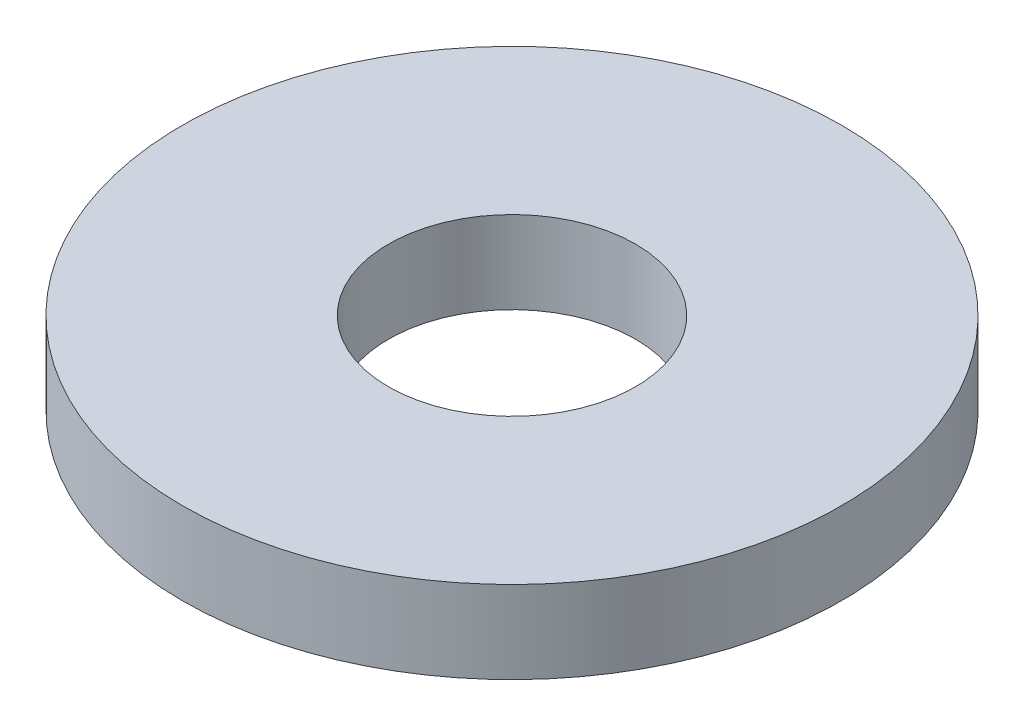
ISO-10303-21;
HEADER;
FILE_DESCRIPTION(('STEP AP214'),'2;1');
FILE_NAME('part.step','',(''),(''),'','','');
FILE_SCHEMA(('AUTOMOTIVE_DESIGN { 1 0 10303 214 1 1 1 1 }'));
ENDSEC;
DATA;
#1=APPLICATION_CONTEXT('core data for automotive mechanical design processes');
#2=APPLICATION_PROTOCOL_DEFINITION('international standard','automotive_design',2000,#1);
#3=PRODUCT_CONTEXT('',#1,'mechanical');
#4=PRODUCT('Part','Part','',(#3));
#5=PRODUCT_RELATED_PRODUCT_CATEGORY('part','',(#4));
#6=PRODUCT_DEFINITION_FORMATION('','',#4);
#7=PRODUCT_DEFINITION_CONTEXT('part definition',#1,'design');
#8=PRODUCT_DEFINITION('design','',#6,#7);
#9=PRODUCT_DEFINITION_SHAPE('','',#8);
#10=(LENGTH_UNIT() NAMED_UNIT(*) SI_UNIT(.MILLI.,.METRE.));
#11=(NAMED_UNIT(*) PLANE_ANGLE_UNIT() SI_UNIT($,.RADIAN.));
#12=(NAMED_UNIT(*) SI_UNIT($,.STERADIAN.) SOLID_ANGLE_UNIT());
#13=UNCERTAINTY_MEASURE_WITH_UNIT(LENGTH_MEASURE(1.E-05),#10,'distance_accuracy_value','');
#14=(GEOMETRIC_REPRESENTATION_CONTEXT(3) GLOBAL_UNCERTAINTY_ASSIGNED_CONTEXT((#13)) GLOBAL_UNIT_ASSIGNED_CONTEXT((#10,
#11,#12)) REPRESENTATION_CONTEXT('',''));
#15=CARTESIAN_POINT('',(0.,0.,0.));
#16=DIRECTION('',(0.,0.,1.));
#17=DIRECTION('',(1.,0.,0.));
#18=AXIS2_PLACEMENT_3D('',#15,#16,#17);
#19=CARTESIAN_POINT('',(0.,1.,0.));
#20=DIRECTION('',(0.,1.,0.));
#21=DIRECTION('',(0.,0.,1.));
#22=AXIS2_PLACEMENT_3D('',#19,#20,#21);
#23=PLANE('',#22);
#24=CARTESIAN_POINT('',(0.,1.,0.));
#25=DIRECTION('',(0.,1.,0.));
#26=DIRECTION('',(0.,0.,1.));
#27=AXIS2_PLACEMENT_3D('',#24,#25,#26);
#28=CIRCLE('',#27,4.);
#29=CARTESIAN_POINT('',(0.,1.,4.));
#30=VERTEX_POINT('',#29);
#31=EDGE_CURVE('E10',#30,#30,#28,.T.);
#32=ORIENTED_EDGE('',*,*,#31,.T.);
#33=EDGE_LOOP('',(#32));
#34=FACE_BOUND('',#33,.T.);
#35=CARTESIAN_POINT('',(0.,1.,0.));
#36=DIRECTION('',(0.,1.,0.));
#37=DIRECTION('',(0.,0.,1.));
#38=AXIS2_PLACEMENT_3D('',#35,#36,#37);
#39=CIRCLE('',#38,1.5);
#40=CARTESIAN_POINT('',(0.,1.,1.5));
#41=VERTEX_POINT('',#40);
#42=EDGE_CURVE('E44',#41,#41,#39,.T.);
#43=ORIENTED_EDGE('',*,*,#42,.F.);
#44=EDGE_LOOP('',(#43));
#45=FACE_BOUND('',#44,.T.);
#46=ADVANCED_FACE('F33',(#34,#45),#23,.T.);
#47=CARTESIAN_POINT('',(0.,0.,0.));
#48=DIRECTION('',(0.,1.,0.));
#49=DIRECTION('',(0.,0.,1.));
#50=AXIS2_PLACEMENT_3D('',#47,#48,#49);
#51=PLANE('',#50);
#52=CARTESIAN_POINT('',(0.,0.,0.));
#53=DIRECTION('',(0.,1.,0.));
#54=DIRECTION('',(0.,0.,1.));
#55=AXIS2_PLACEMENT_3D('',#52,#53,#54);
#56=CIRCLE('',#55,4.);
#57=CARTESIAN_POINT('',(0.,0.,4.));
#58=VERTEX_POINT('',#57);
#59=EDGE_CURVE('E37',#58,#58,#56,.T.);
#60=ORIENTED_EDGE('',*,*,#59,.F.);
#61=EDGE_LOOP('',(#60));
#62=FACE_BOUND('',#61,.T.);
#63=CARTESIAN_POINT('',(0.,0.,0.));
#64=DIRECTION('',(0.,1.,0.));
#65=DIRECTION('',(0.,0.,1.));
#66=AXIS2_PLACEMENT_3D('',#63,#64,#65);
#67=CIRCLE('',#66,1.5);
#68=CARTESIAN_POINT('',(0.,0.,1.5));
#69=VERTEX_POINT('',#68);
#70=EDGE_CURVE('E46',#69,#69,#67,.T.);
#71=ORIENTED_EDGE('',*,*,#70,.T.);
#72=EDGE_LOOP('',(#71));
#73=FACE_BOUND('',#72,.T.);
#74=ADVANCED_FACE('F56',(#62,#73),#51,.F.);
#75=CARTESIAN_POINT('',(0.,1.,0.));
#76=DIRECTION('',(0.,-1.,0.));
#77=DIRECTION('',(0.,0.,-1.));
#78=AXIS2_PLACEMENT_3D('',#75,#76,#77);
#79=CYLINDRICAL_SURFACE('',#78,4.);
#80=ORIENTED_EDGE('',*,*,#31,.F.);
#81=EDGE_LOOP('',(#80));
#82=FACE_BOUND('',#81,.T.);
#83=ORIENTED_EDGE('',*,*,#59,.T.);
#84=EDGE_LOOP('',(#83));
#85=FACE_BOUND('',#84,.T.);
#86=ADVANCED_FACE('F35',(#82,#85),#79,.T.);
#87=CARTESIAN_POINT('',(0.,1.,0.));
#88=DIRECTION('',(0.,-1.,0.));
#89=DIRECTION('',(0.,0.,-1.));
#90=AXIS2_PLACEMENT_3D('',#87,#88,#89);
#91=CYLINDRICAL_SURFACE('',#90,1.5);
#92=ORIENTED_EDGE('',*,*,#42,.T.);
#93=EDGE_LOOP('',(#92));
#94=FACE_BOUND('',#93,.T.);
#95=ORIENTED_EDGE('',*,*,#70,.F.);
#96=EDGE_LOOP('',(#95));
#97=FACE_BOUND('',#96,.T.);
#98=ADVANCED_FACE('F52',(#94,#97),#91,.F.);
#99=CLOSED_SHELL('',(#46,#74,#86,#98));
#100=MANIFOLD_SOLID_BREP('B2',#99);
#101=ADVANCED_BREP_SHAPE_REPRESENTATION('',(#18,#100),#14);
#102=SHAPE_DEFINITION_REPRESENTATION(#9,#101);
ENDSEC;
END-ISO-10303-21;
